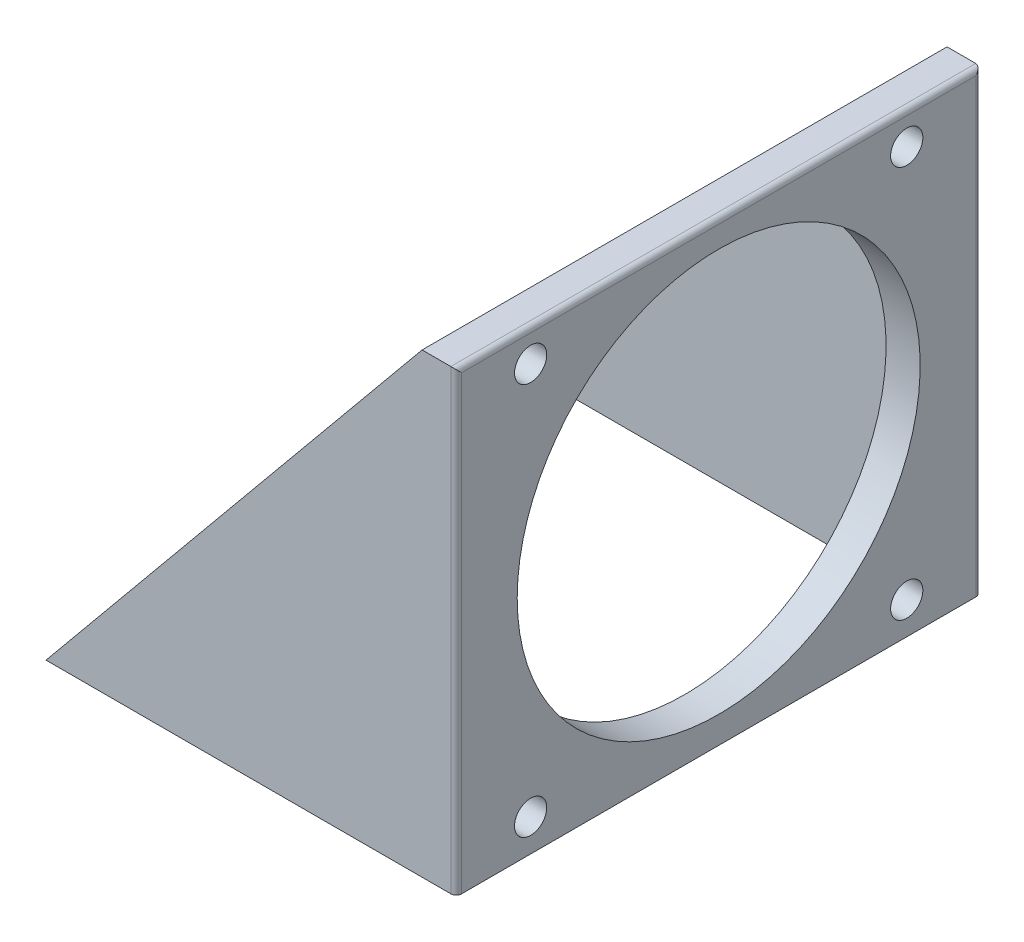
ISO-10303-21;
HEADER;
FILE_DESCRIPTION(('STEP AP214'),'2;1');
FILE_NAME('part.step','',(''),(''),'','','');
FILE_SCHEMA(('AUTOMOTIVE_DESIGN { 1 0 10303 214 1 1 1 1 }'));
ENDSEC;
DATA;
#1=APPLICATION_CONTEXT('core data for automotive mechanical design processes');
#2=APPLICATION_PROTOCOL_DEFINITION('international standard','automotive_design',2000,#1);
#3=PRODUCT_CONTEXT('',#1,'mechanical');
#4=PRODUCT('Part','Part','',(#3));
#5=PRODUCT_RELATED_PRODUCT_CATEGORY('part','',(#4));
#6=PRODUCT_DEFINITION_FORMATION('','',#4);
#7=PRODUCT_DEFINITION_CONTEXT('part definition',#1,'design');
#8=PRODUCT_DEFINITION('design','',#6,#7);
#9=PRODUCT_DEFINITION_SHAPE('','',#8);
#10=(LENGTH_UNIT() NAMED_UNIT(*) SI_UNIT(.MILLI.,.METRE.));
#11=(NAMED_UNIT(*) PLANE_ANGLE_UNIT() SI_UNIT($,.RADIAN.));
#12=(NAMED_UNIT(*) SI_UNIT($,.STERADIAN.) SOLID_ANGLE_UNIT());
#13=UNCERTAINTY_MEASURE_WITH_UNIT(LENGTH_MEASURE(1.E-05),#10,'distance_accuracy_value','');
#14=(GEOMETRIC_REPRESENTATION_CONTEXT(3) GLOBAL_UNCERTAINTY_ASSIGNED_CONTEXT((#13)) GLOBAL_UNIT_ASSIGNED_CONTEXT((#10,
#11,#12)) REPRESENTATION_CONTEXT('',''));
#15=CARTESIAN_POINT('',(0.,0.,0.));
#16=DIRECTION('',(0.,0.,1.));
#17=DIRECTION('',(1.,0.,0.));
#18=AXIS2_PLACEMENT_3D('',#15,#16,#17);
#19=CARTESIAN_POINT('',(-2.04259681093392,68.5,97.7));
#20=DIRECTION('',(1.,0.,0.));
#21=DIRECTION('',(0.,0.,-1.));
#22=AXIS2_PLACEMENT_3D('',#19,#20,#21);
#23=PLANE('',#22);
#24=CARTESIAN_POINT('',(-2.04259681093392,62.5,83.85));
#25=DIRECTION('',(-1.,0.,0.));
#26=DIRECTION('',(0.,0.,-1.));
#27=AXIS2_PLACEMENT_3D('',#24,#25,#26);
#28=CIRCLE('',#27,3.00000000000001);
#29=CARTESIAN_POINT('',(-2.04259681093391,62.5,86.85));
#30=VERTEX_POINT('',#29);
#31=EDGE_CURVE('E212',#30,#30,#28,.T.);
#32=ORIENTED_EDGE('',*,*,#31,.F.);
#33=EDGE_LOOP('',(#32));
#34=FACE_BOUND('',#33,.T.);
#35=CARTESIAN_POINT('',(-2.04259681093392,-10.5,83.85));
#36=DIRECTION('',(-1.,0.,0.));
#37=DIRECTION('',(0.,0.,-1.));
#38=AXIS2_PLACEMENT_3D('',#35,#36,#37);
#39=CIRCLE('',#38,2.99999999999999);
#40=CARTESIAN_POINT('',(-2.04259681093391,-10.5,86.85));
#41=VERTEX_POINT('',#40);
#42=EDGE_CURVE('E217',#41,#41,#39,.T.);
#43=ORIENTED_EDGE('',*,*,#42,.F.);
#44=EDGE_LOOP('',(#43));
#45=FACE_BOUND('',#44,.T.);
#46=CARTESIAN_POINT('',(-2.04259681093392,-10.5,13.85));
#47=DIRECTION('',(-1.,0.,0.));
#48=DIRECTION('',(0.,0.,1.));
#49=AXIS2_PLACEMENT_3D('',#46,#47,#48);
#50=CIRCLE('',#49,3.);
#51=CARTESIAN_POINT('',(-2.04259681093391,-10.5,16.85));
#52=VERTEX_POINT('',#51);
#53=EDGE_CURVE('E224',#52,#52,#50,.T.);
#54=ORIENTED_EDGE('',*,*,#53,.F.);
#55=EDGE_LOOP('',(#54));
#56=FACE_BOUND('',#55,.T.);
#57=CARTESIAN_POINT('',(-2.04259681093392,62.5,13.85));
#58=DIRECTION('',(-1.,0.,0.));
#59=DIRECTION('',(0.,0.,1.));
#60=AXIS2_PLACEMENT_3D('',#57,#58,#59);
#61=CIRCLE('',#60,3.);
#62=CARTESIAN_POINT('',(-2.04259681093391,62.5,16.85));
#63=VERTEX_POINT('',#62);
#64=EDGE_CURVE('E220',#63,#63,#61,.T.);
#65=ORIENTED_EDGE('',*,*,#64,.F.);
#66=EDGE_LOOP('',(#65));
#67=FACE_BOUND('',#66,.T.);
#68=CARTESIAN_POINT('',(-2.04259681093392,26.,48.85));
#69=DIRECTION('',(-1.,0.,0.));
#70=DIRECTION('',(0.,0.,1.));
#71=AXIS2_PLACEMENT_3D('',#68,#69,#70);
#72=CIRCLE('',#71,37.5);
#73=CARTESIAN_POINT('',(-2.04259681093391,26.,86.35));
#74=VERTEX_POINT('',#73);
#75=EDGE_CURVE('E167',#74,#74,#72,.T.);
#76=ORIENTED_EDGE('',*,*,#75,.F.);
#77=EDGE_LOOP('',(#76));
#78=FACE_BOUND('',#77,.T.);
#79=DIRECTION('',(0.,-1.,0.));
#80=VECTOR('',#79,1.);
#81=CARTESIAN_POINT('',(-2.04259681093392,68.5,91.35));
#82=LINE('',#81,#80);
#83=CARTESIAN_POINT('',(-2.04259681093391,68.5,91.35));
#84=VERTEX_POINT('',#83);
#85=CARTESIAN_POINT('',(-2.04259681093392,-16.5,91.35));
#86=VERTEX_POINT('',#85);
#87=EDGE_CURVE('E126',#84,#86,#82,.T.);
#88=ORIENTED_EDGE('',*,*,#87,.F.);
#89=DIRECTION('',(0.,0.,-1.));
#90=VECTOR('',#89,1.);
#91=CARTESIAN_POINT('',(-2.04259681093392,68.5,97.7));
#92=LINE('',#91,#90);
#93=CARTESIAN_POINT('',(-2.04259681093391,68.5,6.35));
#94=VERTEX_POINT('',#93);
#95=EDGE_CURVE('E142',#84,#94,#92,.T.);
#96=ORIENTED_EDGE('',*,*,#95,.T.);
#97=DIRECTION('',(0.,1.,0.));
#98=VECTOR('',#97,1.);
#99=CARTESIAN_POINT('',(-2.04259681093392,68.5,6.35));
#100=LINE('',#99,#98);
#101=CARTESIAN_POINT('',(-2.04259681093392,-16.5,6.35000000000004));
#102=VERTEX_POINT('',#101);
#103=EDGE_CURVE('E250',#102,#94,#100,.T.);
#104=ORIENTED_EDGE('',*,*,#103,.F.);
#105=DIRECTION('',(0.,0.,-1.));
#106=VECTOR('',#105,1.);
#107=CARTESIAN_POINT('',(-2.04259681093392,-16.5,97.7));
#108=LINE('',#107,#106);
#109=EDGE_CURVE('E138',#86,#102,#108,.T.);
#110=ORIENTED_EDGE('',*,*,#109,.F.);
#111=EDGE_LOOP('',(#88,#96,#104,#110));
#112=FACE_BOUND('',#111,.T.);
#113=ADVANCED_FACE('F43',(#34,#45,#56,#67,#78,#112),#23,.F.);
#114=CARTESIAN_POINT('',(4.30740318906608,-10.15,97.7));
#115=DIRECTION('',(-1.,0.,0.));
#116=DIRECTION('',(0.,-1.,0.));
#117=AXIS2_PLACEMENT_3D('',#114,#115,#116);
#118=PLANE('',#117);
#119=CARTESIAN_POINT('',(4.30740318906607,26.,48.85));
#120=DIRECTION('',(-1.,0.,0.));
#121=DIRECTION('',(0.,-1.,0.));
#122=AXIS2_PLACEMENT_3D('',#119,#120,#121);
#123=CIRCLE('',#122,37.5);
#124=CARTESIAN_POINT('',(4.30740318906608,26.,86.35));
#125=VERTEX_POINT('',#124);
#126=EDGE_CURVE('E158',#125,#125,#123,.T.);
#127=ORIENTED_EDGE('',*,*,#126,.T.);
#128=EDGE_LOOP('',(#127));
#129=FACE_BOUND('',#128,.T.);
#130=DIRECTION('',(0.,1.,0.));
#131=VECTOR('',#130,1.);
#132=CARTESIAN_POINT('',(4.30740318906608,-16.5,96.7));
#133=LINE('',#132,#131);
#134=CARTESIAN_POINT('',(4.30740318906608,67.5,96.7));
#135=VERTEX_POINT('',#134);
#136=CARTESIAN_POINT('',(4.30740318906609,-16.5,96.7));
#137=VERTEX_POINT('',#136);
#138=EDGE_CURVE('E175',#135,#137,#133,.F.);
#139=ORIENTED_EDGE('',*,*,#138,.T.);
#140=DIRECTION('',(0.,0.,1.));
#141=VECTOR('',#140,1.);
#142=CARTESIAN_POINT('',(4.30740318906607,-16.5,97.7));
#143=LINE('',#142,#141);
#144=CARTESIAN_POINT('',(4.30740318906607,-16.5,1.));
#145=VERTEX_POINT('',#144);
#146=EDGE_CURVE('E207',#145,#137,#143,.T.);
#147=ORIENTED_EDGE('',*,*,#146,.F.);
#148=DIRECTION('',(0.,1.,0.));
#149=VECTOR('',#148,1.);
#150=CARTESIAN_POINT('',(4.30740318906608,-10.15,1.));
#151=LINE('',#150,#149);
#152=CARTESIAN_POINT('',(4.30740318906608,67.5,1.));
#153=VERTEX_POINT('',#152);
#154=EDGE_CURVE('E185',#145,#153,#151,.T.);
#155=ORIENTED_EDGE('',*,*,#154,.T.);
#156=DIRECTION('',(0.,0.,-1.));
#157=VECTOR('',#156,1.);
#158=CARTESIAN_POINT('',(4.30740318906608,67.5,97.7));
#159=LINE('',#158,#157);
#160=EDGE_CURVE('E182',#153,#135,#159,.F.);
#161=ORIENTED_EDGE('',*,*,#160,.T.);
#162=EDGE_LOOP('',(#139,#147,#155,#161));
#163=FACE_BOUND('',#162,.T.);
#164=CARTESIAN_POINT('',(4.30740318906607,-10.5,83.85));
#165=DIRECTION('',(-1.,0.,0.));
#166=DIRECTION('',(0.,-1.,0.));
#167=AXIS2_PLACEMENT_3D('',#164,#165,#166);
#168=CIRCLE('',#167,2.99999999999999);
#169=CARTESIAN_POINT('',(4.30740318906608,-10.5,86.85));
#170=VERTEX_POINT('',#169);
#171=EDGE_CURVE('E171',#170,#170,#168,.T.);
#172=ORIENTED_EDGE('',*,*,#171,.T.);
#173=EDGE_LOOP('',(#172));
#174=FACE_BOUND('',#173,.T.);
#175=CARTESIAN_POINT('',(4.30740318906607,62.5,83.85));
#176=DIRECTION('',(-1.,0.,0.));
#177=DIRECTION('',(0.,-1.,0.));
#178=AXIS2_PLACEMENT_3D('',#175,#176,#177);
#179=CIRCLE('',#178,3.00000000000001);
#180=CARTESIAN_POINT('',(4.30740318906608,62.5,86.85));
#181=VERTEX_POINT('',#180);
#182=EDGE_CURVE('E134',#181,#181,#179,.T.);
#183=ORIENTED_EDGE('',*,*,#182,.T.);
#184=EDGE_LOOP('',(#183));
#185=FACE_BOUND('',#184,.T.);
#186=CARTESIAN_POINT('',(4.30740318906607,62.5,13.85));
#187=DIRECTION('',(-1.,0.,0.));
#188=DIRECTION('',(0.,-1.,0.));
#189=AXIS2_PLACEMENT_3D('',#186,#187,#188);
#190=CIRCLE('',#189,3.);
#191=CARTESIAN_POINT('',(4.30740318906608,62.5,16.85));
#192=VERTEX_POINT('',#191);
#193=EDGE_CURVE('E163',#192,#192,#190,.T.);
#194=ORIENTED_EDGE('',*,*,#193,.T.);
#195=EDGE_LOOP('',(#194));
#196=FACE_BOUND('',#195,.T.);
#197=CARTESIAN_POINT('',(4.30740318906607,-10.5,13.85));
#198=DIRECTION('',(-1.,0.,0.));
#199=DIRECTION('',(0.,-1.,0.));
#200=AXIS2_PLACEMENT_3D('',#197,#198,#199);
#201=CIRCLE('',#200,3.);
#202=CARTESIAN_POINT('',(4.30740318906608,-10.5,16.85));
#203=VERTEX_POINT('',#202);
#204=EDGE_CURVE('E162',#203,#203,#201,.T.);
#205=ORIENTED_EDGE('',*,*,#204,.T.);
#206=EDGE_LOOP('',(#205));
#207=FACE_BOUND('',#206,.T.);
#208=ADVANCED_FACE('F282',(#129,#163,#174,#185,#196,#207),#118,.F.);
#209=CARTESIAN_POINT('',(4.30740318906608,68.5,97.7));
#210=DIRECTION('',(0.,-1.,0.));
#211=DIRECTION('',(0.,0.,-1.));
#212=AXIS2_PLACEMENT_3D('',#209,#210,#211);
#213=PLANE('',#212);
#214=DIRECTION('',(-1.,0.,0.));
#215=VECTOR('',#214,1.);
#216=CARTESIAN_POINT('',(4.30740318906608,68.5,97.7));
#217=LINE('',#216,#215);
#218=CARTESIAN_POINT('',(3.30740318906608,68.5,97.7));
#219=VERTEX_POINT('',#218);
#220=CARTESIAN_POINT('',(-2.04259681093391,68.5,97.7));
#221=VERTEX_POINT('',#220);
#222=EDGE_CURVE('E131',#219,#221,#217,.T.);
#223=ORIENTED_EDGE('',*,*,#222,.F.);
#224=DIRECTION('',(0.,0.,-1.));
#225=VECTOR('',#224,1.);
#226=CARTESIAN_POINT('',(3.30740318906608,68.5,97.7));
#227=LINE('',#226,#225);
#228=CARTESIAN_POINT('',(3.30740318906608,68.5,0.));
#229=VERTEX_POINT('',#228);
#230=EDGE_CURVE('E53',#219,#229,#227,.T.);
#231=ORIENTED_EDGE('',*,*,#230,.T.);
#232=DIRECTION('',(-1.,0.,0.));
#233=VECTOR('',#232,1.);
#234=CARTESIAN_POINT('',(4.30740318906608,68.5,0.));
#235=LINE('',#234,#233);
#236=CARTESIAN_POINT('',(-2.04259681093391,68.5,0.));
#237=VERTEX_POINT('',#236);
#238=EDGE_CURVE('E148',#229,#237,#235,.T.);
#239=ORIENTED_EDGE('',*,*,#238,.T.);
#240=DIRECTION('',(0.,0.,1.));
#241=VECTOR('',#240,1.);
#242=CARTESIAN_POINT('',(-2.04259681093391,68.5,-22.3));
#243=LINE('',#242,#241);
#244=EDGE_CURVE('E236',#237,#94,#243,.T.);
#245=ORIENTED_EDGE('',*,*,#244,.T.);
#246=ORIENTED_EDGE('',*,*,#95,.F.);
#247=EDGE_CURVE('E133',#84,#221,#243,.T.);
#248=ORIENTED_EDGE('',*,*,#247,.T.);
#249=EDGE_LOOP('',(#223,#231,#239,#245,#246,#248));
#250=FACE_BOUND('',#249,.T.);
#251=ADVANCED_FACE('F270',(#250),#213,.F.);
#252=CARTESIAN_POINT('',(-2.04259681093392,-16.5,97.7));
#253=DIRECTION('',(0.,1.,0.));
#254=DIRECTION('',(0.,0.,1.));
#255=AXIS2_PLACEMENT_3D('',#252,#253,#254);
#256=PLANE('',#255);
#257=ORIENTED_EDGE('',*,*,#146,.T.);
#258=CARTESIAN_POINT('',(3.30740318906608,-16.5,96.7));
#259=DIRECTION('',(0.,1.,0.));
#260=DIRECTION('',(0.,0.,1.));
#261=AXIS2_PLACEMENT_3D('',#258,#259,#260);
#262=CIRCLE('',#261,1.);
#263=CARTESIAN_POINT('',(3.30740318906608,-16.5,97.7));
#264=VERTEX_POINT('',#263);
#265=EDGE_CURVE('E67',#137,#264,#262,.F.);
#266=ORIENTED_EDGE('',*,*,#265,.T.);
#267=DIRECTION('',(1.,0.,0.));
#268=VECTOR('',#267,1.);
#269=CARTESIAN_POINT('',(-2.04259681093392,-16.5,97.7));
#270=LINE('',#269,#268);
#271=CARTESIAN_POINT('',(-72.0425968109339,-16.5,97.7));
#272=VERTEX_POINT('',#271);
#273=EDGE_CURVE('E130',#272,#264,#270,.T.);
#274=ORIENTED_EDGE('',*,*,#273,.F.);
#275=DIRECTION('',(0.,0.,1.));
#276=VECTOR('',#275,1.);
#277=CARTESIAN_POINT('',(-72.0425968109339,-16.5,97.7));
#278=LINE('',#277,#276);
#279=CARTESIAN_POINT('',(-72.0425968109339,-16.5,91.35));
#280=VERTEX_POINT('',#279);
#281=EDGE_CURVE('E116',#280,#272,#278,.T.);
#282=ORIENTED_EDGE('',*,*,#281,.F.);
#283=DIRECTION('',(1.,0.,0.));
#284=VECTOR('',#283,1.);
#285=CARTESIAN_POINT('',(-72.0425968109339,-16.5,91.35));
#286=LINE('',#285,#284);
#287=EDGE_CURVE('E127',#280,#86,#286,.T.);
#288=ORIENTED_EDGE('',*,*,#287,.T.);
#289=ORIENTED_EDGE('',*,*,#109,.T.);
#290=DIRECTION('',(1.,0.,0.));
#291=VECTOR('',#290,1.);
#292=CARTESIAN_POINT('',(-72.0425968109339,-16.5,6.35000000000001));
#293=LINE('',#292,#291);
#294=CARTESIAN_POINT('',(-72.0425968109339,-16.5,6.35));
#295=VERTEX_POINT('',#294);
#296=EDGE_CURVE('E151',#295,#102,#293,.T.);
#297=ORIENTED_EDGE('',*,*,#296,.F.);
#298=DIRECTION('',(0.,0.,1.));
#299=VECTOR('',#298,1.);
#300=CARTESIAN_POINT('',(-72.0425968109339,-16.5,0.));
#301=LINE('',#300,#299);
#302=CARTESIAN_POINT('',(-72.0425968109339,-16.5,0.));
#303=VERTEX_POINT('',#302);
#304=EDGE_CURVE('E252',#303,#295,#301,.T.);
#305=ORIENTED_EDGE('',*,*,#304,.F.);
#306=DIRECTION('',(1.,0.,0.));
#307=VECTOR('',#306,1.);
#308=CARTESIAN_POINT('',(-2.04259681093392,-16.5,0.));
#309=LINE('',#308,#307);
#310=CARTESIAN_POINT('',(3.30740318906608,-16.5,0.));
#311=VERTEX_POINT('',#310);
#312=EDGE_CURVE('E144',#303,#311,#309,.T.);
#313=ORIENTED_EDGE('',*,*,#312,.T.);
#314=CARTESIAN_POINT('',(3.30740318906608,-16.5,1.));
#315=DIRECTION('',(0.,1.,0.));
#316=DIRECTION('',(0.,0.,1.));
#317=AXIS2_PLACEMENT_3D('',#314,#315,#316);
#318=CIRCLE('',#317,1.);
#319=EDGE_CURVE('E194',#311,#145,#318,.F.);
#320=ORIENTED_EDGE('',*,*,#319,.T.);
#321=EDGE_LOOP('',(#257,#266,#274,#282,#288,#289,#297,#305,#313,#320));
#322=FACE_BOUND('',#321,.T.);
#323=ADVANCED_FACE('F136',(#322),#256,.F.);
#324=CARTESIAN_POINT('',(0.,0.,97.7));
#325=DIRECTION('',(0.,0.,1.));
#326=DIRECTION('',(1.,0.,0.));
#327=AXIS2_PLACEMENT_3D('',#324,#325,#326);
#328=PLANE('',#327);
#329=ORIENTED_EDGE('',*,*,#273,.T.);
#330=DIRECTION('',(0.,1.,0.));
#331=VECTOR('',#330,1.);
#332=CARTESIAN_POINT('',(3.30740318906608,68.5,97.7));
#333=LINE('',#332,#331);
#334=EDGE_CURVE('E11',#264,#219,#333,.T.);
#335=ORIENTED_EDGE('',*,*,#334,.T.);
#336=ORIENTED_EDGE('',*,*,#222,.T.);
#337=DIRECTION('',(0.6357072528611,0.77193023561705,0.));
#338=VECTOR('',#337,1.);
#339=CARTESIAN_POINT('',(-72.0425968109339,-16.5,97.7));
#340=LINE('',#339,#338);
#341=EDGE_CURVE('E119',#272,#221,#340,.T.);
#342=ORIENTED_EDGE('',*,*,#341,.F.);
#343=EDGE_LOOP('',(#329,#335,#336,#342));
#344=FACE_BOUND('',#343,.T.);
#345=ADVANCED_FACE('F129',(#344),#328,.T.);
#346=CARTESIAN_POINT('',(0.,0.,0.));
#347=DIRECTION('',(0.,0.,1.));
#348=DIRECTION('',(1.,0.,0.));
#349=AXIS2_PLACEMENT_3D('',#346,#347,#348);
#350=PLANE('',#349);
#351=ORIENTED_EDGE('',*,*,#238,.F.);
#352=DIRECTION('',(0.,1.,0.));
#353=VECTOR('',#352,1.);
#354=CARTESIAN_POINT('',(3.30740318906608,0.,0.));
#355=LINE('',#354,#353);
#356=EDGE_CURVE('E189',#229,#311,#355,.F.);
#357=ORIENTED_EDGE('',*,*,#356,.T.);
#358=ORIENTED_EDGE('',*,*,#312,.F.);
#359=DIRECTION('',(0.6357072528611,0.77193023561705,0.));
#360=VECTOR('',#359,1.);
#361=CARTESIAN_POINT('',(-34.8315679966184,28.6848207030975,0.));
#362=LINE('',#361,#360);
#363=EDGE_CURVE('E243',#303,#237,#362,.T.);
#364=ORIENTED_EDGE('',*,*,#363,.T.);
#365=EDGE_LOOP('',(#351,#357,#358,#364));
#366=FACE_BOUND('',#365,.T.);
#367=ADVANCED_FACE('F278',(#366),#350,.F.);
#368=CARTESIAN_POINT('',(-72.0425968109339,68.5,6.35));
#369=DIRECTION('',(0.,0.,-1.));
#370=DIRECTION('',(0.,1.,0.));
#371=AXIS2_PLACEMENT_3D('',#368,#369,#370);
#372=PLANE('',#371);
#373=ORIENTED_EDGE('',*,*,#103,.T.);
#374=DIRECTION('',(-0.6357072528611,-0.77193023561705,0.));
#375=VECTOR('',#374,1.);
#376=CARTESIAN_POINT('',(-30.3312566047484,34.1494845360825,6.35));
#377=LINE('',#376,#375);
#378=EDGE_CURVE('E239',#94,#295,#377,.T.);
#379=ORIENTED_EDGE('',*,*,#378,.T.);
#380=ORIENTED_EDGE('',*,*,#296,.T.);
#381=EDGE_LOOP('',(#373,#379,#380));
#382=FACE_BOUND('',#381,.T.);
#383=ADVANCED_FACE('F261',(#382),#372,.F.);
#384=CARTESIAN_POINT('',(-72.0425968109339,68.5,91.35));
#385=DIRECTION('',(0.,0.,1.));
#386=DIRECTION('',(0.,-1.,0.));
#387=AXIS2_PLACEMENT_3D('',#384,#385,#386);
#388=PLANE('',#387);
#389=ORIENTED_EDGE('',*,*,#287,.F.);
#390=DIRECTION('',(0.6357072528611,0.77193023561705,0.));
#391=VECTOR('',#390,1.);
#392=CARTESIAN_POINT('',(-30.3312566047484,34.1494845360825,91.35));
#393=LINE('',#392,#391);
#394=EDGE_CURVE('E122',#280,#84,#393,.T.);
#395=ORIENTED_EDGE('',*,*,#394,.T.);
#396=ORIENTED_EDGE('',*,*,#87,.T.);
#397=EDGE_LOOP('',(#389,#395,#396));
#398=FACE_BOUND('',#397,.T.);
#399=ADVANCED_FACE('F321',(#398),#388,.F.);
#400=CARTESIAN_POINT('',(-72.0425968109339,-16.5,-22.3));
#401=DIRECTION('',(0.77193023561705,-0.6357072528611,0.));
#402=DIRECTION('',(0.6357072528611,0.77193023561705,0.));
#403=AXIS2_PLACEMENT_3D('',#400,#401,#402);
#404=PLANE('',#403);
#405=ORIENTED_EDGE('',*,*,#281,.T.);
#406=ORIENTED_EDGE('',*,*,#341,.T.);
#407=ORIENTED_EDGE('',*,*,#247,.F.);
#408=ORIENTED_EDGE('',*,*,#394,.F.);
#409=EDGE_LOOP('',(#405,#406,#407,#408));
#410=FACE_BOUND('',#409,.T.);
#411=ADVANCED_FACE('F118',(#410),#404,.F.);
#412=ORIENTED_EDGE('',*,*,#304,.T.);
#413=ORIENTED_EDGE('',*,*,#378,.F.);
#414=ORIENTED_EDGE('',*,*,#244,.F.);
#415=ORIENTED_EDGE('',*,*,#363,.F.);
#416=EDGE_LOOP('',(#412,#413,#414,#415));
#417=FACE_BOUND('',#416,.T.);
#418=ADVANCED_FACE('F275',(#417),#404,.F.);
#419=CARTESIAN_POINT('',(117.957403189066,26.,48.85));
#420=DIRECTION('',(-1.,0.,0.));
#421=DIRECTION('',(0.,0.,1.));
#422=AXIS2_PLACEMENT_3D('',#419,#420,#421);
#423=CYLINDRICAL_SURFACE('',#422,37.5);
#424=CARTESIAN_POINT('',(-2.04259681093391,26.,86.35));
#425=CARTESIAN_POINT('',(-1.97645097760058,26.,86.35));
#426=CARTESIAN_POINT('',(-1.91030514426725,26.,86.35));
#427=CARTESIAN_POINT('',(-1.77801347760058,26.,86.35));
#428=CARTESIAN_POINT('',(-1.71186764426724,26.,86.35));
#429=CARTESIAN_POINT('',(-1.57957597760057,26.,86.35));
#430=CARTESIAN_POINT('',(-1.51343014426724,26.,86.35));
#431=CARTESIAN_POINT('',(-1.38113847760058,26.,86.35));
#432=CARTESIAN_POINT('',(-1.31499264426725,26.,86.35));
#433=CARTESIAN_POINT('',(-1.18270097760058,26.,86.35));
#434=CARTESIAN_POINT('',(-1.11655514426724,26.,86.35));
#435=CARTESIAN_POINT('',(-0.984263477600574,26.,86.35));
#436=CARTESIAN_POINT('',(-0.918117644267242,26.,86.35));
#437=CARTESIAN_POINT('',(-0.785825977600578,26.,86.35));
#438=CARTESIAN_POINT('',(-0.719680144267247,26.,86.35));
#439=CARTESIAN_POINT('',(-0.587388477600583,26.,86.35));
#440=CARTESIAN_POINT('',(-0.521242644267251,26.,86.35));
#441=CARTESIAN_POINT('',(-0.388950977600583,26.,86.35));
#442=CARTESIAN_POINT('',(-0.322805144267246,26.,86.35));
#443=CARTESIAN_POINT('',(-0.190513477600578,26.,86.35));
#444=CARTESIAN_POINT('',(-0.124367644267246,26.,86.35));
#445=CARTESIAN_POINT('',(0.00792402239941739,26.,86.35));
#446=CARTESIAN_POINT('',(0.0740698557327492,26.,86.35));
#447=CARTESIAN_POINT('',(0.206361522399418,26.,86.35));
#448=CARTESIAN_POINT('',(0.272507355732754,26.,86.35));
#449=CARTESIAN_POINT('',(0.404799022399422,26.,86.35));
#450=CARTESIAN_POINT('',(0.470944855732754,26.,86.35));
#451=CARTESIAN_POINT('',(0.603236522399418,26.,86.35));
#452=CARTESIAN_POINT('',(0.66938235573275,26.,86.35));
#453=CARTESIAN_POINT('',(0.801674022399418,26.,86.35));
#454=CARTESIAN_POINT('',(0.867819855732754,26.,86.35));
#455=CARTESIAN_POINT('',(1.00011152239942,26.,86.35));
#456=CARTESIAN_POINT('',(1.06625735573275,26.,86.35));
#457=CARTESIAN_POINT('',(1.19854902239942,26.,86.35));
#458=CARTESIAN_POINT('',(1.26469485573275,26.,86.35));
#459=CARTESIAN_POINT('',(1.39698652239942,26.,86.35));
#460=CARTESIAN_POINT('',(1.46313235573275,26.,86.35));
#461=CARTESIAN_POINT('',(1.59542402239942,26.,86.35));
#462=CARTESIAN_POINT('',(1.66156985573275,26.,86.35));
#463=CARTESIAN_POINT('',(1.79386152239942,26.,86.35));
#464=CARTESIAN_POINT('',(1.86000735573275,26.,86.35));
#465=CARTESIAN_POINT('',(1.99229902239942,26.,86.35));
#466=CARTESIAN_POINT('',(2.05844485573276,26.,86.35));
#467=CARTESIAN_POINT('',(2.19073652239942,26.,86.35));
#468=CARTESIAN_POINT('',(2.25688235573276,26.,86.35));
#469=CARTESIAN_POINT('',(2.38917402239942,26.,86.35));
#470=CARTESIAN_POINT('',(2.45531985573275,26.,86.35));
#471=CARTESIAN_POINT('',(2.58761152239942,26.,86.35));
#472=CARTESIAN_POINT('',(2.65375735573276,26.,86.35));
#473=CARTESIAN_POINT('',(2.78604902239942,26.,86.35));
#474=CARTESIAN_POINT('',(2.85219485573276,26.,86.35));
#475=CARTESIAN_POINT('',(2.98448652239942,26.,86.35));
#476=CARTESIAN_POINT('',(3.05063235573275,26.,86.35));
#477=CARTESIAN_POINT('',(3.18292402239941,26.,86.35));
#478=CARTESIAN_POINT('',(3.24906985573275,26.,86.35));
#479=CARTESIAN_POINT('',(3.38136152239941,26.,86.35));
#480=CARTESIAN_POINT('',(3.44750735573275,26.,86.35));
#481=CARTESIAN_POINT('',(3.57979902239942,26.,86.35));
#482=CARTESIAN_POINT('',(3.64594485573275,26.,86.35));
#483=CARTESIAN_POINT('',(3.77823652239941,26.,86.35));
#484=CARTESIAN_POINT('',(3.84438235573275,26.,86.35));
#485=CARTESIAN_POINT('',(3.97667402239942,26.,86.35));
#486=CARTESIAN_POINT('',(4.04281985573275,26.,86.35));
#487=CARTESIAN_POINT('',(4.17511152239942,26.,86.35));
#488=CARTESIAN_POINT('',(4.24125735573275,26.,86.35));
#489=CARTESIAN_POINT('',(4.30740318906608,26.,86.35));
#490=B_SPLINE_CURVE_WITH_KNOTS('',3,(#424,#425,#426,#427,#428,#429,#430,#431,#432,#433,#434,
#435,#436,#437,#438,#439,#440,#441,#442,#443,#444,#445,#446,#447,#448,#449,#450,#451,#452,#453,
#454,#455,#456,#457,#458,#459,#460,#461,#462,#463,#464,#465,#466,#467,#468,#469,#470,#471,#472,
#473,#474,#475,#476,#477,#478,#479,#480,#481,#482,#483,#484,#485,#486,#487,#488,#489),
.UNSPECIFIED.,.F.,.F.,(4,2,2,2,2,2,2,2,2,2,2,2,2,2,2,2,2,2,2,2,2,2,2,2,2,2,2,2,2,2,2,2,4),(0.,
0.198437499999995,0.396875000000005,0.5953125,0.793749999999996,0.992187500000005,1.190625,
1.3890625,1.58749999999999,1.7859375,1.984375,2.18281249999999,2.38125,2.5796875,
2.77812499999999,2.9765625,3.175,3.37343749999999,3.571875,3.7703125,3.96874999999999,4.1671875,
4.365625,4.56406249999999,4.7625,4.9609375,5.15937499999999,5.35781249999999,5.55625,
5.75468749999999,5.95312499999999,6.1515625,6.34999999999999),.UNSPECIFIED.);
#491=EDGE_CURVE('BSEAM327',#74,#125,#490,.T.);
#492=ORIENTED_EDGE('',*,*,#75,.T.);
#493=ORIENTED_EDGE('',*,*,#126,.F.);
#494=ORIENTED_EDGE('',*,*,#491,.T.);
#495=ORIENTED_EDGE('',*,*,#491,.F.);
#496=EDGE_LOOP('',(#492,#494,#493,#495));
#497=FACE_BOUND('',#496,.T.);
#498=ADVANCED_FACE('F327',(#497),#423,.F.);
#499=CARTESIAN_POINT('',(117.957403189066,62.5,13.85));
#500=DIRECTION('',(-1.,0.,0.));
#501=DIRECTION('',(0.,0.,1.));
#502=AXIS2_PLACEMENT_3D('',#499,#500,#501);
#503=CYLINDRICAL_SURFACE('',#502,3.);
#504=CARTESIAN_POINT('',(-2.04259681093391,62.5,16.85));
#505=CARTESIAN_POINT('',(-1.97645097760058,62.5,16.85));
#506=CARTESIAN_POINT('',(-1.91030514426725,62.5,16.85));
#507=CARTESIAN_POINT('',(-1.77801347760058,62.5,16.85));
#508=CARTESIAN_POINT('',(-1.71186764426724,62.5,16.85));
#509=CARTESIAN_POINT('',(-1.57957597760057,62.5,16.85));
#510=CARTESIAN_POINT('',(-1.51343014426724,62.5,16.85));
#511=CARTESIAN_POINT('',(-1.38113847760058,62.5,16.85));
#512=CARTESIAN_POINT('',(-1.31499264426725,62.5,16.85));
#513=CARTESIAN_POINT('',(-1.18270097760058,62.5,16.85));
#514=CARTESIAN_POINT('',(-1.11655514426724,62.5,16.85));
#515=CARTESIAN_POINT('',(-0.984263477600574,62.5,16.85));
#516=CARTESIAN_POINT('',(-0.918117644267242,62.5,16.85));
#517=CARTESIAN_POINT('',(-0.785825977600578,62.5,16.85));
#518=CARTESIAN_POINT('',(-0.719680144267247,62.5,16.85));
#519=CARTESIAN_POINT('',(-0.587388477600583,62.5,16.85));
#520=CARTESIAN_POINT('',(-0.521242644267251,62.5,16.85));
#521=CARTESIAN_POINT('',(-0.388950977600583,62.5,16.85));
#522=CARTESIAN_POINT('',(-0.322805144267246,62.5,16.85));
#523=CARTESIAN_POINT('',(-0.190513477600578,62.5,16.85));
#524=CARTESIAN_POINT('',(-0.124367644267246,62.5,16.85));
#525=CARTESIAN_POINT('',(0.00792402239941739,62.5,16.85));
#526=CARTESIAN_POINT('',(0.0740698557327492,62.5,16.85));
#527=CARTESIAN_POINT('',(0.206361522399418,62.5,16.85));
#528=CARTESIAN_POINT('',(0.272507355732754,62.5,16.85));
#529=CARTESIAN_POINT('',(0.404799022399422,62.5,16.85));
#530=CARTESIAN_POINT('',(0.470944855732754,62.5,16.85));
#531=CARTESIAN_POINT('',(0.603236522399418,62.5,16.85));
#532=CARTESIAN_POINT('',(0.66938235573275,62.5,16.85));
#533=CARTESIAN_POINT('',(0.801674022399418,62.5,16.85));
#534=CARTESIAN_POINT('',(0.867819855732754,62.5,16.85));
#535=CARTESIAN_POINT('',(1.00011152239942,62.5,16.85));
#536=CARTESIAN_POINT('',(1.06625735573275,62.5,16.85));
#537=CARTESIAN_POINT('',(1.19854902239942,62.5,16.85));
#538=CARTESIAN_POINT('',(1.26469485573275,62.5,16.85));
#539=CARTESIAN_POINT('',(1.39698652239942,62.5,16.85));
#540=CARTESIAN_POINT('',(1.46313235573275,62.5,16.85));
#541=CARTESIAN_POINT('',(1.59542402239942,62.5,16.85));
#542=CARTESIAN_POINT('',(1.66156985573275,62.5,16.85));
#543=CARTESIAN_POINT('',(1.79386152239942,62.5,16.85));
#544=CARTESIAN_POINT('',(1.86000735573275,62.5,16.85));
#545=CARTESIAN_POINT('',(1.99229902239942,62.5,16.85));
#546=CARTESIAN_POINT('',(2.05844485573276,62.5,16.85));
#547=CARTESIAN_POINT('',(2.19073652239942,62.5,16.85));
#548=CARTESIAN_POINT('',(2.25688235573276,62.5,16.85));
#549=CARTESIAN_POINT('',(2.38917402239942,62.5,16.85));
#550=CARTESIAN_POINT('',(2.45531985573275,62.5,16.85));
#551=CARTESIAN_POINT('',(2.58761152239942,62.5,16.85));
#552=CARTESIAN_POINT('',(2.65375735573276,62.5,16.85));
#553=CARTESIAN_POINT('',(2.78604902239942,62.5,16.85));
#554=CARTESIAN_POINT('',(2.85219485573276,62.5,16.85));
#555=CARTESIAN_POINT('',(2.98448652239942,62.5,16.85));
#556=CARTESIAN_POINT('',(3.05063235573275,62.5,16.85));
#557=CARTESIAN_POINT('',(3.18292402239941,62.5,16.85));
#558=CARTESIAN_POINT('',(3.24906985573275,62.5,16.85));
#559=CARTESIAN_POINT('',(3.38136152239941,62.5,16.85));
#560=CARTESIAN_POINT('',(3.44750735573275,62.5,16.85));
#561=CARTESIAN_POINT('',(3.57979902239942,62.5,16.85));
#562=CARTESIAN_POINT('',(3.64594485573275,62.5,16.85));
#563=CARTESIAN_POINT('',(3.77823652239941,62.5,16.85));
#564=CARTESIAN_POINT('',(3.84438235573275,62.5,16.85));
#565=CARTESIAN_POINT('',(3.97667402239942,62.5,16.85));
#566=CARTESIAN_POINT('',(4.04281985573275,62.5,16.85));
#567=CARTESIAN_POINT('',(4.17511152239942,62.5,16.85));
#568=CARTESIAN_POINT('',(4.24125735573275,62.5,16.85));
#569=CARTESIAN_POINT('',(4.30740318906608,62.5,16.85));
#570=B_SPLINE_CURVE_WITH_KNOTS('',3,(#504,#505,#506,#507,#508,#509,#510,#511,#512,#513,#514,
#515,#516,#517,#518,#519,#520,#521,#522,#523,#524,#525,#526,#527,#528,#529,#530,#531,#532,#533,
#534,#535,#536,#537,#538,#539,#540,#541,#542,#543,#544,#545,#546,#547,#548,#549,#550,#551,#552,
#553,#554,#555,#556,#557,#558,#559,#560,#561,#562,#563,#564,#565,#566,#567,#568,#569),
.UNSPECIFIED.,.F.,.F.,(4,2,2,2,2,2,2,2,2,2,2,2,2,2,2,2,2,2,2,2,2,2,2,2,2,2,2,2,2,2,2,2,4),(0.,
0.198437499999995,0.396875000000005,0.5953125,0.793749999999996,0.992187500000005,1.190625,
1.3890625,1.58749999999999,1.7859375,1.984375,2.18281249999999,2.38125,2.5796875,
2.77812499999999,2.9765625,3.175,3.37343749999999,3.571875,3.7703125,3.96874999999999,4.1671875,
4.365625,4.56406249999999,4.7625,4.9609375,5.15937499999999,5.35781249999999,5.55625,
5.75468749999999,5.95312499999999,6.1515625,6.34999999999999),.UNSPECIFIED.);
#571=EDGE_CURVE('BSEAM330',#63,#192,#570,.T.);
#572=ORIENTED_EDGE('',*,*,#64,.T.);
#573=ORIENTED_EDGE('',*,*,#193,.F.);
#574=ORIENTED_EDGE('',*,*,#571,.T.);
#575=ORIENTED_EDGE('',*,*,#571,.F.);
#576=EDGE_LOOP('',(#572,#574,#573,#575));
#577=FACE_BOUND('',#576,.T.);
#578=ADVANCED_FACE('F330',(#577),#503,.F.);
#579=CARTESIAN_POINT('',(117.957403189066,-10.5,13.85));
#580=DIRECTION('',(-1.,0.,0.));
#581=DIRECTION('',(0.,0.,1.));
#582=AXIS2_PLACEMENT_3D('',#579,#580,#581);
#583=CYLINDRICAL_SURFACE('',#582,3.);
#584=CARTESIAN_POINT('',(-2.04259681093391,-10.5,16.85));
#585=CARTESIAN_POINT('',(-1.97645097760058,-10.5,16.85));
#586=CARTESIAN_POINT('',(-1.91030514426725,-10.5,16.85));
#587=CARTESIAN_POINT('',(-1.77801347760058,-10.5,16.85));
#588=CARTESIAN_POINT('',(-1.71186764426724,-10.5,16.85));
#589=CARTESIAN_POINT('',(-1.57957597760057,-10.5,16.85));
#590=CARTESIAN_POINT('',(-1.51343014426724,-10.5,16.85));
#591=CARTESIAN_POINT('',(-1.38113847760058,-10.5,16.85));
#592=CARTESIAN_POINT('',(-1.31499264426725,-10.5,16.85));
#593=CARTESIAN_POINT('',(-1.18270097760058,-10.5,16.85));
#594=CARTESIAN_POINT('',(-1.11655514426724,-10.5,16.85));
#595=CARTESIAN_POINT('',(-0.984263477600574,-10.5,16.85));
#596=CARTESIAN_POINT('',(-0.918117644267242,-10.5,16.85));
#597=CARTESIAN_POINT('',(-0.785825977600578,-10.5,16.85));
#598=CARTESIAN_POINT('',(-0.719680144267247,-10.5,16.85));
#599=CARTESIAN_POINT('',(-0.587388477600583,-10.5,16.85));
#600=CARTESIAN_POINT('',(-0.521242644267251,-10.5,16.85));
#601=CARTESIAN_POINT('',(-0.388950977600583,-10.5,16.85));
#602=CARTESIAN_POINT('',(-0.322805144267246,-10.5,16.85));
#603=CARTESIAN_POINT('',(-0.190513477600578,-10.5,16.85));
#604=CARTESIAN_POINT('',(-0.124367644267246,-10.5,16.85));
#605=CARTESIAN_POINT('',(0.00792402239941739,-10.5,16.85));
#606=CARTESIAN_POINT('',(0.0740698557327492,-10.5,16.85));
#607=CARTESIAN_POINT('',(0.206361522399418,-10.5,16.85));
#608=CARTESIAN_POINT('',(0.272507355732754,-10.5,16.85));
#609=CARTESIAN_POINT('',(0.404799022399422,-10.5,16.85));
#610=CARTESIAN_POINT('',(0.470944855732754,-10.5,16.85));
#611=CARTESIAN_POINT('',(0.603236522399418,-10.5,16.85));
#612=CARTESIAN_POINT('',(0.66938235573275,-10.5,16.85));
#613=CARTESIAN_POINT('',(0.801674022399418,-10.5,16.85));
#614=CARTESIAN_POINT('',(0.867819855732754,-10.5,16.85));
#615=CARTESIAN_POINT('',(1.00011152239942,-10.5,16.85));
#616=CARTESIAN_POINT('',(1.06625735573275,-10.5,16.85));
#617=CARTESIAN_POINT('',(1.19854902239942,-10.5,16.85));
#618=CARTESIAN_POINT('',(1.26469485573275,-10.5,16.85));
#619=CARTESIAN_POINT('',(1.39698652239942,-10.5,16.85));
#620=CARTESIAN_POINT('',(1.46313235573275,-10.5,16.85));
#621=CARTESIAN_POINT('',(1.59542402239942,-10.5,16.85));
#622=CARTESIAN_POINT('',(1.66156985573275,-10.5,16.85));
#623=CARTESIAN_POINT('',(1.79386152239942,-10.5,16.85));
#624=CARTESIAN_POINT('',(1.86000735573275,-10.5,16.85));
#625=CARTESIAN_POINT('',(1.99229902239942,-10.5,16.85));
#626=CARTESIAN_POINT('',(2.05844485573276,-10.5,16.85));
#627=CARTESIAN_POINT('',(2.19073652239942,-10.5,16.85));
#628=CARTESIAN_POINT('',(2.25688235573276,-10.5,16.85));
#629=CARTESIAN_POINT('',(2.38917402239942,-10.5,16.85));
#630=CARTESIAN_POINT('',(2.45531985573275,-10.5,16.85));
#631=CARTESIAN_POINT('',(2.58761152239942,-10.5,16.85));
#632=CARTESIAN_POINT('',(2.65375735573276,-10.5,16.85));
#633=CARTESIAN_POINT('',(2.78604902239942,-10.5,16.85));
#634=CARTESIAN_POINT('',(2.85219485573276,-10.5,16.85));
#635=CARTESIAN_POINT('',(2.98448652239942,-10.5,16.85));
#636=CARTESIAN_POINT('',(3.05063235573275,-10.5,16.85));
#637=CARTESIAN_POINT('',(3.18292402239941,-10.5,16.85));
#638=CARTESIAN_POINT('',(3.24906985573275,-10.5,16.85));
#639=CARTESIAN_POINT('',(3.38136152239941,-10.5,16.85));
#640=CARTESIAN_POINT('',(3.44750735573275,-10.5,16.85));
#641=CARTESIAN_POINT('',(3.57979902239942,-10.5,16.85));
#642=CARTESIAN_POINT('',(3.64594485573275,-10.5,16.85));
#643=CARTESIAN_POINT('',(3.77823652239941,-10.5,16.85));
#644=CARTESIAN_POINT('',(3.84438235573275,-10.5,16.85));
#645=CARTESIAN_POINT('',(3.97667402239942,-10.5,16.85));
#646=CARTESIAN_POINT('',(4.04281985573275,-10.5,16.85));
#647=CARTESIAN_POINT('',(4.17511152239942,-10.5,16.85));
#648=CARTESIAN_POINT('',(4.24125735573275,-10.5,16.85));
#649=CARTESIAN_POINT('',(4.30740318906608,-10.5,16.85));
#650=B_SPLINE_CURVE_WITH_KNOTS('',3,(#584,#585,#586,#587,#588,#589,#590,#591,#592,#593,#594,
#595,#596,#597,#598,#599,#600,#601,#602,#603,#604,#605,#606,#607,#608,#609,#610,#611,#612,#613,
#614,#615,#616,#617,#618,#619,#620,#621,#622,#623,#624,#625,#626,#627,#628,#629,#630,#631,#632,
#633,#634,#635,#636,#637,#638,#639,#640,#641,#642,#643,#644,#645,#646,#647,#648,#649),
.UNSPECIFIED.,.F.,.F.,(4,2,2,2,2,2,2,2,2,2,2,2,2,2,2,2,2,2,2,2,2,2,2,2,2,2,2,2,2,2,2,2,4),(0.,
0.198437499999995,0.396875000000005,0.5953125,0.793749999999996,0.992187500000005,1.190625,
1.3890625,1.58749999999999,1.7859375,1.984375,2.18281249999999,2.38125,2.5796875,
2.77812499999999,2.9765625,3.175,3.37343749999999,3.571875,3.7703125,3.96874999999999,4.1671875,
4.365625,4.56406249999999,4.7625,4.9609375,5.15937499999999,5.35781249999999,5.55625,
5.75468749999999,5.95312499999999,6.1515625,6.34999999999999),.UNSPECIFIED.);
#651=EDGE_CURVE('BSEAM338',#52,#203,#650,.T.);
#652=ORIENTED_EDGE('',*,*,#53,.T.);
#653=ORIENTED_EDGE('',*,*,#204,.F.);
#654=ORIENTED_EDGE('',*,*,#651,.T.);
#655=ORIENTED_EDGE('',*,*,#651,.F.);
#656=EDGE_LOOP('',(#652,#654,#653,#655));
#657=FACE_BOUND('',#656,.T.);
#658=ADVANCED_FACE('F338',(#657),#583,.F.);
#659=CARTESIAN_POINT('',(117.957403189066,-10.5,83.85));
#660=DIRECTION('',(-1.,0.,0.));
#661=DIRECTION('',(0.,0.,1.));
#662=AXIS2_PLACEMENT_3D('',#659,#660,#661);
#663=CYLINDRICAL_SURFACE('',#662,2.99999999999999);
#664=CARTESIAN_POINT('',(-2.04259681093391,-10.5,86.85));
#665=CARTESIAN_POINT('',(-1.97645097760058,-10.5,86.85));
#666=CARTESIAN_POINT('',(-1.91030514426725,-10.5,86.85));
#667=CARTESIAN_POINT('',(-1.77801347760058,-10.5,86.85));
#668=CARTESIAN_POINT('',(-1.71186764426724,-10.5,86.85));
#669=CARTESIAN_POINT('',(-1.57957597760057,-10.5,86.85));
#670=CARTESIAN_POINT('',(-1.51343014426724,-10.5,86.85));
#671=CARTESIAN_POINT('',(-1.38113847760058,-10.5,86.85));
#672=CARTESIAN_POINT('',(-1.31499264426725,-10.5,86.85));
#673=CARTESIAN_POINT('',(-1.18270097760058,-10.5,86.85));
#674=CARTESIAN_POINT('',(-1.11655514426724,-10.5,86.85));
#675=CARTESIAN_POINT('',(-0.984263477600574,-10.5,86.85));
#676=CARTESIAN_POINT('',(-0.918117644267242,-10.5,86.85));
#677=CARTESIAN_POINT('',(-0.785825977600578,-10.5,86.85));
#678=CARTESIAN_POINT('',(-0.719680144267247,-10.5,86.85));
#679=CARTESIAN_POINT('',(-0.587388477600583,-10.5,86.85));
#680=CARTESIAN_POINT('',(-0.521242644267251,-10.5,86.85));
#681=CARTESIAN_POINT('',(-0.388950977600583,-10.5,86.85));
#682=CARTESIAN_POINT('',(-0.322805144267246,-10.5,86.85));
#683=CARTESIAN_POINT('',(-0.190513477600578,-10.5,86.85));
#684=CARTESIAN_POINT('',(-0.124367644267246,-10.5,86.85));
#685=CARTESIAN_POINT('',(0.00792402239941739,-10.5,86.85));
#686=CARTESIAN_POINT('',(0.0740698557327492,-10.5,86.85));
#687=CARTESIAN_POINT('',(0.206361522399418,-10.5,86.85));
#688=CARTESIAN_POINT('',(0.272507355732754,-10.5,86.85));
#689=CARTESIAN_POINT('',(0.404799022399422,-10.5,86.85));
#690=CARTESIAN_POINT('',(0.470944855732754,-10.5,86.85));
#691=CARTESIAN_POINT('',(0.603236522399418,-10.5,86.85));
#692=CARTESIAN_POINT('',(0.66938235573275,-10.5,86.85));
#693=CARTESIAN_POINT('',(0.801674022399418,-10.5,86.85));
#694=CARTESIAN_POINT('',(0.867819855732754,-10.5,86.85));
#695=CARTESIAN_POINT('',(1.00011152239942,-10.5,86.85));
#696=CARTESIAN_POINT('',(1.06625735573275,-10.5,86.85));
#697=CARTESIAN_POINT('',(1.19854902239942,-10.5,86.85));
#698=CARTESIAN_POINT('',(1.26469485573275,-10.5,86.85));
#699=CARTESIAN_POINT('',(1.39698652239942,-10.5,86.85));
#700=CARTESIAN_POINT('',(1.46313235573275,-10.5,86.85));
#701=CARTESIAN_POINT('',(1.59542402239942,-10.5,86.85));
#702=CARTESIAN_POINT('',(1.66156985573275,-10.5,86.85));
#703=CARTESIAN_POINT('',(1.79386152239942,-10.5,86.85));
#704=CARTESIAN_POINT('',(1.86000735573275,-10.5,86.85));
#705=CARTESIAN_POINT('',(1.99229902239942,-10.5,86.85));
#706=CARTESIAN_POINT('',(2.05844485573276,-10.5,86.85));
#707=CARTESIAN_POINT('',(2.19073652239942,-10.5,86.85));
#708=CARTESIAN_POINT('',(2.25688235573276,-10.5,86.85));
#709=CARTESIAN_POINT('',(2.38917402239942,-10.5,86.85));
#710=CARTESIAN_POINT('',(2.45531985573275,-10.5,86.85));
#711=CARTESIAN_POINT('',(2.58761152239942,-10.5,86.85));
#712=CARTESIAN_POINT('',(2.65375735573276,-10.5,86.85));
#713=CARTESIAN_POINT('',(2.78604902239942,-10.5,86.85));
#714=CARTESIAN_POINT('',(2.85219485573276,-10.5,86.85));
#715=CARTESIAN_POINT('',(2.98448652239942,-10.5,86.85));
#716=CARTESIAN_POINT('',(3.05063235573275,-10.5,86.85));
#717=CARTESIAN_POINT('',(3.18292402239941,-10.5,86.85));
#718=CARTESIAN_POINT('',(3.24906985573275,-10.5,86.85));
#719=CARTESIAN_POINT('',(3.38136152239941,-10.5,86.85));
#720=CARTESIAN_POINT('',(3.44750735573275,-10.5,86.85));
#721=CARTESIAN_POINT('',(3.57979902239942,-10.5,86.85));
#722=CARTESIAN_POINT('',(3.64594485573275,-10.5,86.85));
#723=CARTESIAN_POINT('',(3.77823652239941,-10.5,86.85));
#724=CARTESIAN_POINT('',(3.84438235573275,-10.5,86.85));
#725=CARTESIAN_POINT('',(3.97667402239942,-10.5,86.85));
#726=CARTESIAN_POINT('',(4.04281985573275,-10.5,86.85));
#727=CARTESIAN_POINT('',(4.17511152239942,-10.5,86.85));
#728=CARTESIAN_POINT('',(4.24125735573275,-10.5,86.85));
#729=CARTESIAN_POINT('',(4.30740318906608,-10.5,86.85));
#730=B_SPLINE_CURVE_WITH_KNOTS('',3,(#664,#665,#666,#667,#668,#669,#670,#671,#672,#673,#674,
#675,#676,#677,#678,#679,#680,#681,#682,#683,#684,#685,#686,#687,#688,#689,#690,#691,#692,#693,
#694,#695,#696,#697,#698,#699,#700,#701,#702,#703,#704,#705,#706,#707,#708,#709,#710,#711,#712,
#713,#714,#715,#716,#717,#718,#719,#720,#721,#722,#723,#724,#725,#726,#727,#728,#729),
.UNSPECIFIED.,.F.,.F.,(4,2,2,2,2,2,2,2,2,2,2,2,2,2,2,2,2,2,2,2,2,2,2,2,2,2,2,2,2,2,2,2,4),(0.,
0.198437499999995,0.396875000000005,0.5953125,0.793749999999996,0.992187500000005,1.190625,
1.3890625,1.58749999999999,1.7859375,1.984375,2.18281249999999,2.38125,2.5796875,
2.77812499999999,2.9765625,3.175,3.37343749999999,3.571875,3.7703125,3.96874999999999,4.1671875,
4.365625,4.56406249999999,4.7625,4.9609375,5.15937499999999,5.35781249999999,5.55625,
5.75468749999999,5.95312499999999,6.1515625,6.34999999999999),.UNSPECIFIED.);
#731=EDGE_CURVE('BSEAM334',#41,#170,#730,.T.);
#732=ORIENTED_EDGE('',*,*,#42,.T.);
#733=ORIENTED_EDGE('',*,*,#171,.F.);
#734=ORIENTED_EDGE('',*,*,#731,.T.);
#735=ORIENTED_EDGE('',*,*,#731,.F.);
#736=EDGE_LOOP('',(#732,#734,#733,#735));
#737=FACE_BOUND('',#736,.T.);
#738=ADVANCED_FACE('F334',(#737),#663,.F.);
#739=CARTESIAN_POINT('',(117.957403189066,62.5,83.85));
#740=DIRECTION('',(-1.,0.,0.));
#741=DIRECTION('',(0.,0.,1.));
#742=AXIS2_PLACEMENT_3D('',#739,#740,#741);
#743=CYLINDRICAL_SURFACE('',#742,3.00000000000001);
#744=CARTESIAN_POINT('',(-2.04259681093391,62.5,86.85));
#745=CARTESIAN_POINT('',(-1.97645097760058,62.5,86.85));
#746=CARTESIAN_POINT('',(-1.91030514426725,62.5,86.85));
#747=CARTESIAN_POINT('',(-1.77801347760058,62.5,86.85));
#748=CARTESIAN_POINT('',(-1.71186764426724,62.5,86.85));
#749=CARTESIAN_POINT('',(-1.57957597760057,62.5,86.85));
#750=CARTESIAN_POINT('',(-1.51343014426724,62.5,86.85));
#751=CARTESIAN_POINT('',(-1.38113847760058,62.5,86.85));
#752=CARTESIAN_POINT('',(-1.31499264426725,62.5,86.85));
#753=CARTESIAN_POINT('',(-1.18270097760058,62.5,86.85));
#754=CARTESIAN_POINT('',(-1.11655514426724,62.5,86.85));
#755=CARTESIAN_POINT('',(-0.984263477600574,62.5,86.85));
#756=CARTESIAN_POINT('',(-0.918117644267242,62.5,86.85));
#757=CARTESIAN_POINT('',(-0.785825977600578,62.5,86.85));
#758=CARTESIAN_POINT('',(-0.719680144267247,62.5,86.85));
#759=CARTESIAN_POINT('',(-0.587388477600583,62.5,86.85));
#760=CARTESIAN_POINT('',(-0.521242644267251,62.5,86.85));
#761=CARTESIAN_POINT('',(-0.388950977600583,62.5,86.85));
#762=CARTESIAN_POINT('',(-0.322805144267246,62.5,86.85));
#763=CARTESIAN_POINT('',(-0.190513477600578,62.5,86.85));
#764=CARTESIAN_POINT('',(-0.124367644267246,62.5,86.85));
#765=CARTESIAN_POINT('',(0.00792402239941739,62.5,86.85));
#766=CARTESIAN_POINT('',(0.0740698557327492,62.5,86.85));
#767=CARTESIAN_POINT('',(0.206361522399418,62.5,86.85));
#768=CARTESIAN_POINT('',(0.272507355732754,62.5,86.85));
#769=CARTESIAN_POINT('',(0.404799022399422,62.5,86.85));
#770=CARTESIAN_POINT('',(0.470944855732754,62.5,86.85));
#771=CARTESIAN_POINT('',(0.603236522399418,62.5,86.85));
#772=CARTESIAN_POINT('',(0.66938235573275,62.5,86.85));
#773=CARTESIAN_POINT('',(0.801674022399418,62.5,86.85));
#774=CARTESIAN_POINT('',(0.867819855732754,62.5,86.85));
#775=CARTESIAN_POINT('',(1.00011152239942,62.5,86.85));
#776=CARTESIAN_POINT('',(1.06625735573275,62.5,86.85));
#777=CARTESIAN_POINT('',(1.19854902239942,62.5,86.85));
#778=CARTESIAN_POINT('',(1.26469485573275,62.5,86.85));
#779=CARTESIAN_POINT('',(1.39698652239942,62.5,86.85));
#780=CARTESIAN_POINT('',(1.46313235573275,62.5,86.85));
#781=CARTESIAN_POINT('',(1.59542402239942,62.5,86.85));
#782=CARTESIAN_POINT('',(1.66156985573275,62.5,86.85));
#783=CARTESIAN_POINT('',(1.79386152239942,62.5,86.85));
#784=CARTESIAN_POINT('',(1.86000735573275,62.5,86.85));
#785=CARTESIAN_POINT('',(1.99229902239942,62.5,86.85));
#786=CARTESIAN_POINT('',(2.05844485573276,62.5,86.85));
#787=CARTESIAN_POINT('',(2.19073652239942,62.5,86.85));
#788=CARTESIAN_POINT('',(2.25688235573276,62.5,86.85));
#789=CARTESIAN_POINT('',(2.38917402239942,62.5,86.85));
#790=CARTESIAN_POINT('',(2.45531985573275,62.5,86.85));
#791=CARTESIAN_POINT('',(2.58761152239942,62.5,86.85));
#792=CARTESIAN_POINT('',(2.65375735573276,62.5,86.85));
#793=CARTESIAN_POINT('',(2.78604902239942,62.5,86.85));
#794=CARTESIAN_POINT('',(2.85219485573276,62.5,86.85));
#795=CARTESIAN_POINT('',(2.98448652239942,62.5,86.85));
#796=CARTESIAN_POINT('',(3.05063235573275,62.5,86.85));
#797=CARTESIAN_POINT('',(3.18292402239941,62.5,86.85));
#798=CARTESIAN_POINT('',(3.24906985573275,62.5,86.85));
#799=CARTESIAN_POINT('',(3.38136152239941,62.5,86.85));
#800=CARTESIAN_POINT('',(3.44750735573275,62.5,86.85));
#801=CARTESIAN_POINT('',(3.57979902239942,62.5,86.85));
#802=CARTESIAN_POINT('',(3.64594485573275,62.5,86.85));
#803=CARTESIAN_POINT('',(3.77823652239941,62.5,86.85));
#804=CARTESIAN_POINT('',(3.84438235573275,62.5,86.85));
#805=CARTESIAN_POINT('',(3.97667402239942,62.5,86.85));
#806=CARTESIAN_POINT('',(4.04281985573275,62.5,86.85));
#807=CARTESIAN_POINT('',(4.17511152239942,62.5,86.85));
#808=CARTESIAN_POINT('',(4.24125735573275,62.5,86.85));
#809=CARTESIAN_POINT('',(4.30740318906608,62.5,86.85));
#810=B_SPLINE_CURVE_WITH_KNOTS('',3,(#744,#745,#746,#747,#748,#749,#750,#751,#752,#753,#754,
#755,#756,#757,#758,#759,#760,#761,#762,#763,#764,#765,#766,#767,#768,#769,#770,#771,#772,#773,
#774,#775,#776,#777,#778,#779,#780,#781,#782,#783,#784,#785,#786,#787,#788,#789,#790,#791,#792,
#793,#794,#795,#796,#797,#798,#799,#800,#801,#802,#803,#804,#805,#806,#807,#808,#809),
.UNSPECIFIED.,.F.,.F.,(4,2,2,2,2,2,2,2,2,2,2,2,2,2,2,2,2,2,2,2,2,2,2,2,2,2,2,2,2,2,2,2,4),(0.,
0.198437499999995,0.396875000000005,0.5953125,0.793749999999996,0.992187500000005,1.190625,
1.3890625,1.58749999999999,1.7859375,1.984375,2.18281249999999,2.38125,2.5796875,
2.77812499999999,2.9765625,3.175,3.37343749999999,3.571875,3.7703125,3.96874999999999,4.1671875,
4.365625,4.56406249999999,4.7625,4.9609375,5.15937499999999,5.35781249999999,5.55625,
5.75468749999999,5.95312499999999,6.1515625,6.34999999999999),.UNSPECIFIED.);
#811=EDGE_CURVE('BSEAM293',#30,#181,#810,.T.);
#812=ORIENTED_EDGE('',*,*,#31,.T.);
#813=ORIENTED_EDGE('',*,*,#182,.F.);
#814=ORIENTED_EDGE('',*,*,#811,.T.);
#815=ORIENTED_EDGE('',*,*,#811,.F.);
#816=EDGE_LOOP('',(#812,#814,#813,#815));
#817=FACE_BOUND('',#816,.T.);
#818=ADVANCED_FACE('F293',(#817),#743,.F.);
#819=CARTESIAN_POINT('',(3.30740318906608,0.,96.7));
#820=DIRECTION('',(0.,-1.,0.));
#821=DIRECTION('',(1.,0.,0.));
#822=AXIS2_PLACEMENT_3D('',#819,#820,#821);
#823=CYLINDRICAL_SURFACE('',#822,1.);
#824=ORIENTED_EDGE('',*,*,#265,.F.);
#825=ORIENTED_EDGE('',*,*,#138,.F.);
#826=CARTESIAN_POINT('',(3.30740318906608,67.5,96.7));
#827=DIRECTION('',(0.,-0.707106781186547,0.707106781186547));
#828=DIRECTION('',(0.,-0.707106781186547,-0.707106781186547));
#829=AXIS2_PLACEMENT_3D('',#826,#827,#828);
#830=ELLIPSE('',#829,1.41421356237309,1.);
#831=EDGE_CURVE('E47',#219,#135,#830,.F.);
#832=ORIENTED_EDGE('',*,*,#831,.F.);
#833=ORIENTED_EDGE('',*,*,#334,.F.);
#834=EDGE_LOOP('',(#824,#825,#832,#833));
#835=FACE_BOUND('',#834,.T.);
#836=ADVANCED_FACE('F45',(#835),#823,.T.);
#837=CARTESIAN_POINT('',(3.30740318906608,67.5,97.7));
#838=DIRECTION('',(0.,0.,-1.));
#839=DIRECTION('',(-1.,0.,0.));
#840=AXIS2_PLACEMENT_3D('',#837,#838,#839);
#841=CYLINDRICAL_SURFACE('',#840,1.);
#842=ORIENTED_EDGE('',*,*,#831,.T.);
#843=ORIENTED_EDGE('',*,*,#160,.F.);
#844=CARTESIAN_POINT('',(3.30740318906608,67.5,1.));
#845=DIRECTION('',(0.,-0.707106781186547,-0.707106781186547));
#846=DIRECTION('',(0.,0.707106781186547,-0.707106781186547));
#847=AXIS2_PLACEMENT_3D('',#844,#845,#846);
#848=ELLIPSE('',#847,1.41421356237309,1.);
#849=EDGE_CURVE('E198',#229,#153,#848,.T.);
#850=ORIENTED_EDGE('',*,*,#849,.F.);
#851=ORIENTED_EDGE('',*,*,#230,.F.);
#852=EDGE_LOOP('',(#842,#843,#850,#851));
#853=FACE_BOUND('',#852,.T.);
#854=ADVANCED_FACE('F286',(#853),#841,.T.);
#855=CARTESIAN_POINT('',(3.30740318906608,-10.15,1.));
#856=DIRECTION('',(0.,1.,0.));
#857=DIRECTION('',(-1.,0.,0.));
#858=AXIS2_PLACEMENT_3D('',#855,#856,#857);
#859=CYLINDRICAL_SURFACE('',#858,1.);
#860=ORIENTED_EDGE('',*,*,#319,.F.);
#861=ORIENTED_EDGE('',*,*,#356,.F.);
#862=ORIENTED_EDGE('',*,*,#849,.T.);
#863=ORIENTED_EDGE('',*,*,#154,.F.);
#864=EDGE_LOOP('',(#860,#861,#862,#863));
#865=FACE_BOUND('',#864,.T.);
#866=ADVANCED_FACE('F280',(#865),#859,.T.);
#867=CLOSED_SHELL('',(#113,#208,#251,#323,#345,#367,#383,#399,#411,#418,#498,#578,#658,#738,
#818,#836,#854,#866));
#868=MANIFOLD_SOLID_BREP('B2',#867);
#869=ADVANCED_BREP_SHAPE_REPRESENTATION('',(#18,#868),#14);
#870=SHAPE_DEFINITION_REPRESENTATION(#9,#869);
ENDSEC;
END-ISO-10303-21;
